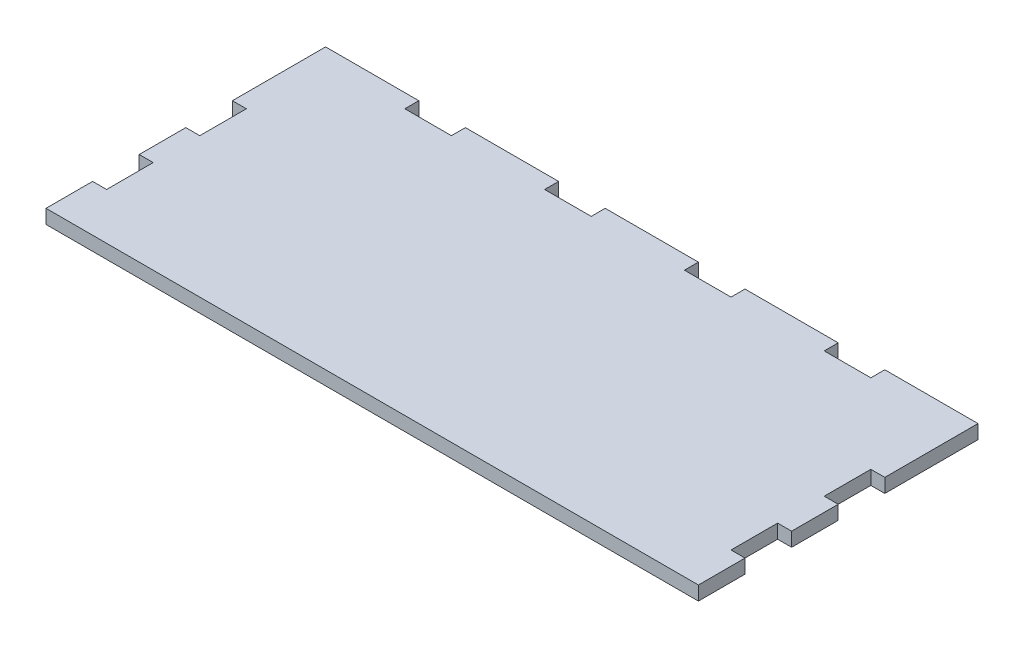
ISO-10303-21;
HEADER;
FILE_DESCRIPTION(('STEP AP214'),'2;1');
FILE_NAME('part.step','',(''),(''),'','','');
FILE_SCHEMA(('AUTOMOTIVE_DESIGN { 1 0 10303 214 1 1 1 1 }'));
ENDSEC;
DATA;
#1=APPLICATION_CONTEXT('core data for automotive mechanical design processes');
#2=APPLICATION_PROTOCOL_DEFINITION('international standard','automotive_design',2000,#1);
#3=PRODUCT_CONTEXT('',#1,'mechanical');
#4=PRODUCT('Part','Part','',(#3));
#5=PRODUCT_RELATED_PRODUCT_CATEGORY('part','',(#4));
#6=PRODUCT_DEFINITION_FORMATION('','',#4);
#7=PRODUCT_DEFINITION_CONTEXT('part definition',#1,'design');
#8=PRODUCT_DEFINITION('design','',#6,#7);
#9=PRODUCT_DEFINITION_SHAPE('','',#8);
#10=(LENGTH_UNIT() NAMED_UNIT(*) SI_UNIT(.MILLI.,.METRE.));
#11=(NAMED_UNIT(*) PLANE_ANGLE_UNIT() SI_UNIT($,.RADIAN.));
#12=(NAMED_UNIT(*) SI_UNIT($,.STERADIAN.) SOLID_ANGLE_UNIT());
#13=UNCERTAINTY_MEASURE_WITH_UNIT(LENGTH_MEASURE(1.E-05),#10,'distance_accuracy_value','');
#14=(GEOMETRIC_REPRESENTATION_CONTEXT(3) GLOBAL_UNCERTAINTY_ASSIGNED_CONTEXT((#13)) GLOBAL_UNIT_ASSIGNED_CONTEXT((#10,
#11,#12)) REPRESENTATION_CONTEXT('',''));
#15=CARTESIAN_POINT('',(0.,0.,0.));
#16=DIRECTION('',(0.,0.,1.));
#17=DIRECTION('',(1.,0.,0.));
#18=AXIS2_PLACEMENT_3D('',#15,#16,#17);
#19=CARTESIAN_POINT('',(70.,3.,-30.));
#20=DIRECTION('',(0.,0.,1.));
#21=DIRECTION('',(1.,0.,0.));
#22=AXIS2_PLACEMENT_3D('',#19,#20,#21);
#23=PLANE('',#22);
#24=DIRECTION('',(-1.,0.,0.));
#25=VECTOR('',#24,1.);
#26=CARTESIAN_POINT('',(70.,3.,-30.));
#27=LINE('',#26,#25);
#28=CARTESIAN_POINT('',(-50.,3.,-30.));
#29=VERTEX_POINT('',#28);
#30=CARTESIAN_POINT('',(-70.,3.,-30.));
#31=VERTEX_POINT('',#30);
#32=EDGE_CURVE('E425',#29,#31,#27,.T.);
#33=ORIENTED_EDGE('',*,*,#32,.F.);
#34=DIRECTION('',(0.,1.,0.));
#35=VECTOR('',#34,1.);
#36=CARTESIAN_POINT('',(-50.,-10.,-30.));
#37=LINE('',#36,#35);
#38=CARTESIAN_POINT('',(-50.,0.,-30.));
#39=VERTEX_POINT('',#38);
#40=EDGE_CURVE('E282',#39,#29,#37,.T.);
#41=ORIENTED_EDGE('',*,*,#40,.F.);
#42=DIRECTION('',(-1.,0.,0.));
#43=VECTOR('',#42,1.);
#44=CARTESIAN_POINT('',(70.,0.,-30.));
#45=LINE('',#44,#43);
#46=CARTESIAN_POINT('',(-70.,0.,-30.));
#47=VERTEX_POINT('',#46);
#48=EDGE_CURVE('E442',#39,#47,#45,.T.);
#49=ORIENTED_EDGE('',*,*,#48,.T.);
#50=DIRECTION('',(0.,-1.,0.));
#51=VECTOR('',#50,1.);
#52=CARTESIAN_POINT('',(-70.,3.,-30.));
#53=LINE('',#52,#51);
#54=EDGE_CURVE('E430',#31,#47,#53,.T.);
#55=ORIENTED_EDGE('',*,*,#54,.F.);
#56=EDGE_LOOP('',(#33,#41,#49,#55));
#57=FACE_BOUND('',#56,.T.);
#58=ADVANCED_FACE('F36',(#57),#23,.F.);
#59=CARTESIAN_POINT('',(9.99999999999999,0.,-30.));
#60=VERTEX_POINT('',#59);
#61=CARTESIAN_POINT('',(-10.,0.,-30.));
#62=VERTEX_POINT('',#61);
#63=EDGE_CURVE('E553',#60,#62,#45,.T.);
#64=ORIENTED_EDGE('',*,*,#63,.T.);
#65=DIRECTION('',(0.,1.,0.));
#66=VECTOR('',#65,1.);
#67=CARTESIAN_POINT('',(-10.,-10.,-30.));
#68=LINE('',#67,#66);
#69=CARTESIAN_POINT('',(-10.,3.,-30.));
#70=VERTEX_POINT('',#69);
#71=EDGE_CURVE('E285',#62,#70,#68,.T.);
#72=ORIENTED_EDGE('',*,*,#71,.T.);
#73=CARTESIAN_POINT('',(9.99999999999999,3.,-30.));
#74=VERTEX_POINT('',#73);
#75=EDGE_CURVE('E520',#74,#70,#27,.T.);
#76=ORIENTED_EDGE('',*,*,#75,.F.);
#77=DIRECTION('',(0.,1.,0.));
#78=VECTOR('',#77,1.);
#79=CARTESIAN_POINT('',(9.99999999999999,-10.,-30.));
#80=LINE('',#79,#78);
#81=EDGE_CURVE('E322',#60,#74,#80,.T.);
#82=ORIENTED_EDGE('',*,*,#81,.F.);
#83=EDGE_LOOP('',(#64,#72,#76,#82));
#84=FACE_BOUND('',#83,.T.);
#85=ADVANCED_FACE('F552',(#84),#23,.F.);
#86=CARTESIAN_POINT('',(40.,0.,-30.));
#87=VERTEX_POINT('',#86);
#88=CARTESIAN_POINT('',(20.,0.,-30.));
#89=VERTEX_POINT('',#88);
#90=EDGE_CURVE('E447',#87,#89,#45,.T.);
#91=ORIENTED_EDGE('',*,*,#90,.T.);
#92=DIRECTION('',(0.,1.,0.));
#93=VECTOR('',#92,1.);
#94=CARTESIAN_POINT('',(20.,-10.,-30.));
#95=LINE('',#94,#93);
#96=CARTESIAN_POINT('',(20.,3.,-30.));
#97=VERTEX_POINT('',#96);
#98=EDGE_CURVE('E301',#89,#97,#95,.T.);
#99=ORIENTED_EDGE('',*,*,#98,.T.);
#100=CARTESIAN_POINT('',(40.,3.,-30.));
#101=VERTEX_POINT('',#100);
#102=EDGE_CURVE('E431',#101,#97,#27,.T.);
#103=ORIENTED_EDGE('',*,*,#102,.F.);
#104=DIRECTION('',(0.,1.,0.));
#105=VECTOR('',#104,1.);
#106=CARTESIAN_POINT('',(40.,-10.,-30.));
#107=LINE('',#106,#105);
#108=EDGE_CURVE('E338',#87,#101,#107,.T.);
#109=ORIENTED_EDGE('',*,*,#108,.F.);
#110=EDGE_LOOP('',(#91,#99,#103,#109));
#111=FACE_BOUND('',#110,.T.);
#112=ADVANCED_FACE('F536',(#111),#23,.F.);
#113=CARTESIAN_POINT('',(70.,0.,-30.));
#114=VERTEX_POINT('',#113);
#115=CARTESIAN_POINT('',(50.,0.,-30.));
#116=VERTEX_POINT('',#115);
#117=EDGE_CURVE('E444',#114,#116,#45,.T.);
#118=ORIENTED_EDGE('',*,*,#117,.T.);
#119=DIRECTION('',(0.,1.,0.));
#120=VECTOR('',#119,1.);
#121=CARTESIAN_POINT('',(50.,-10.,-30.));
#122=LINE('',#121,#120);
#123=CARTESIAN_POINT('',(50.,3.,-30.));
#124=VERTEX_POINT('',#123);
#125=EDGE_CURVE('E317',#116,#124,#122,.T.);
#126=ORIENTED_EDGE('',*,*,#125,.T.);
#127=CARTESIAN_POINT('',(70.,3.,-30.));
#128=VERTEX_POINT('',#127);
#129=EDGE_CURVE('E427',#128,#124,#27,.T.);
#130=ORIENTED_EDGE('',*,*,#129,.F.);
#131=DIRECTION('',(0.,-1.,0.));
#132=VECTOR('',#131,1.);
#133=CARTESIAN_POINT('',(70.,3.,-30.));
#134=LINE('',#133,#132);
#135=EDGE_CURVE('E450',#128,#114,#134,.T.);
#136=ORIENTED_EDGE('',*,*,#135,.T.);
#137=EDGE_LOOP('',(#118,#126,#130,#136));
#138=FACE_BOUND('',#137,.T.);
#139=ADVANCED_FACE('F586',(#138),#23,.F.);
#140=CARTESIAN_POINT('',(-70.,3.,-30.));
#141=DIRECTION('',(1.,0.,0.));
#142=DIRECTION('',(0.,0.,-1.));
#143=AXIS2_PLACEMENT_3D('',#140,#141,#142);
#144=PLANE('',#143);
#145=DIRECTION('',(0.,0.,1.));
#146=VECTOR('',#145,1.);
#147=CARTESIAN_POINT('',(-70.,0.,-30.));
#148=LINE('',#147,#146);
#149=CARTESIAN_POINT('',(-70.,0.,0.));
#150=VERTEX_POINT('',#149);
#151=CARTESIAN_POINT('',(-70.,0.,10.));
#152=VERTEX_POINT('',#151);
#153=EDGE_CURVE('E436',#150,#152,#148,.T.);
#154=ORIENTED_EDGE('',*,*,#153,.T.);
#155=DIRECTION('',(0.,1.,0.));
#156=VECTOR('',#155,1.);
#157=CARTESIAN_POINT('',(-70.,-7.,10.));
#158=LINE('',#157,#156);
#159=CARTESIAN_POINT('',(-70.,3.,10.));
#160=VERTEX_POINT('',#159);
#161=EDGE_CURVE('E366',#152,#160,#158,.T.);
#162=ORIENTED_EDGE('',*,*,#161,.T.);
#163=DIRECTION('',(0.,0.,1.));
#164=VECTOR('',#163,1.);
#165=CARTESIAN_POINT('',(-70.,3.,-30.));
#166=LINE('',#165,#164);
#167=CARTESIAN_POINT('',(-70.,3.,0.));
#168=VERTEX_POINT('',#167);
#169=EDGE_CURVE('E418',#168,#160,#166,.T.);
#170=ORIENTED_EDGE('',*,*,#169,.F.);
#171=DIRECTION('',(0.,1.,0.));
#172=VECTOR('',#171,1.);
#173=CARTESIAN_POINT('',(-70.,-7.,0.));
#174=LINE('',#173,#172);
#175=EDGE_CURVE('E353',#150,#168,#174,.T.);
#176=ORIENTED_EDGE('',*,*,#175,.F.);
#177=EDGE_LOOP('',(#154,#162,#170,#176));
#178=FACE_BOUND('',#177,.T.);
#179=ADVANCED_FACE('F597',(#178),#144,.F.);
#180=CARTESIAN_POINT('',(-70.,0.,-9.99999999999999));
#181=VERTEX_POINT('',#180);
#182=EDGE_CURVE('E432',#47,#181,#148,.T.);
#183=ORIENTED_EDGE('',*,*,#182,.T.);
#184=DIRECTION('',(0.,1.,0.));
#185=VECTOR('',#184,1.);
#186=CARTESIAN_POINT('',(-70.,-7.,-9.99999999999999));
#187=LINE('',#186,#185);
#188=CARTESIAN_POINT('',(-70.,3.,-9.99999999999999));
#189=VERTEX_POINT('',#188);
#190=EDGE_CURVE('E354',#181,#189,#187,.T.);
#191=ORIENTED_EDGE('',*,*,#190,.T.);
#192=EDGE_CURVE('E414',#31,#189,#166,.T.);
#193=ORIENTED_EDGE('',*,*,#192,.F.);
#194=ORIENTED_EDGE('',*,*,#54,.T.);
#195=EDGE_LOOP('',(#183,#191,#193,#194));
#196=FACE_BOUND('',#195,.T.);
#197=ADVANCED_FACE('F603',(#196),#144,.F.);
#198=CARTESIAN_POINT('',(70.,3.,-30.));
#199=DIRECTION('',(-1.,0.,0.));
#200=DIRECTION('',(0.,0.,1.));
#201=AXIS2_PLACEMENT_3D('',#198,#199,#200);
#202=PLANE('',#201);
#203=DIRECTION('',(0.,0.,-1.));
#204=VECTOR('',#203,1.);
#205=CARTESIAN_POINT('',(70.,0.,-30.));
#206=LINE('',#205,#204);
#207=CARTESIAN_POINT('',(70.,0.,10.));
#208=VERTEX_POINT('',#207);
#209=CARTESIAN_POINT('',(70.,0.,0.));
#210=VERTEX_POINT('',#209);
#211=EDGE_CURVE('E443',#208,#210,#206,.T.);
#212=ORIENTED_EDGE('',*,*,#211,.T.);
#213=DIRECTION('',(0.,1.,0.));
#214=VECTOR('',#213,1.);
#215=CARTESIAN_POINT('',(70.,-7.,0.));
#216=LINE('',#215,#214);
#217=CARTESIAN_POINT('',(70.,3.,0.));
#218=VERTEX_POINT('',#217);
#219=EDGE_CURVE('E372',#210,#218,#216,.T.);
#220=ORIENTED_EDGE('',*,*,#219,.T.);
#221=DIRECTION('',(0.,0.,-1.));
#222=VECTOR('',#221,1.);
#223=CARTESIAN_POINT('',(70.,3.,-30.));
#224=LINE('',#223,#222);
#225=CARTESIAN_POINT('',(70.,3.,10.));
#226=VERTEX_POINT('',#225);
#227=EDGE_CURVE('E426',#226,#218,#224,.T.);
#228=ORIENTED_EDGE('',*,*,#227,.F.);
#229=DIRECTION('',(0.,1.,0.));
#230=VECTOR('',#229,1.);
#231=CARTESIAN_POINT('',(70.,-7.,10.));
#232=LINE('',#231,#230);
#233=EDGE_CURVE('E404',#208,#226,#232,.T.);
#234=ORIENTED_EDGE('',*,*,#233,.F.);
#235=EDGE_LOOP('',(#212,#220,#228,#234));
#236=FACE_BOUND('',#235,.T.);
#237=ADVANCED_FACE('F594',(#236),#202,.F.);
#238=CARTESIAN_POINT('',(70.,0.,30.));
#239=VERTEX_POINT('',#238);
#240=CARTESIAN_POINT('',(70.,0.,20.));
#241=VERTEX_POINT('',#240);
#242=EDGE_CURVE('E439',#239,#241,#206,.T.);
#243=ORIENTED_EDGE('',*,*,#242,.T.);
#244=DIRECTION('',(0.,1.,0.));
#245=VECTOR('',#244,1.);
#246=CARTESIAN_POINT('',(70.,-7.,20.));
#247=LINE('',#246,#245);
#248=CARTESIAN_POINT('',(70.,3.,20.));
#249=VERTEX_POINT('',#248);
#250=EDGE_CURVE('E405',#241,#249,#247,.T.);
#251=ORIENTED_EDGE('',*,*,#250,.T.);
#252=CARTESIAN_POINT('',(70.,3.,30.));
#253=VERTEX_POINT('',#252);
#254=EDGE_CURVE('E422',#253,#249,#224,.T.);
#255=ORIENTED_EDGE('',*,*,#254,.F.);
#256=DIRECTION('',(0.,-1.,0.));
#257=VECTOR('',#256,1.);
#258=CARTESIAN_POINT('',(70.,3.,30.));
#259=LINE('',#258,#257);
#260=EDGE_CURVE('E453',#253,#239,#259,.T.);
#261=ORIENTED_EDGE('',*,*,#260,.T.);
#262=EDGE_LOOP('',(#243,#251,#255,#261));
#263=FACE_BOUND('',#262,.T.);
#264=ADVANCED_FACE('F595',(#263),#202,.F.);
#265=CARTESIAN_POINT('',(-70.,3.,20.));
#266=VERTEX_POINT('',#265);
#267=CARTESIAN_POINT('',(-70.,3.,30.));
#268=VERTEX_POINT('',#267);
#269=EDGE_CURVE('E419',#266,#268,#166,.T.);
#270=ORIENTED_EDGE('',*,*,#269,.F.);
#271=DIRECTION('',(0.,1.,0.));
#272=VECTOR('',#271,1.);
#273=CARTESIAN_POINT('',(-70.,-7.,20.));
#274=LINE('',#273,#272);
#275=CARTESIAN_POINT('',(-70.,0.,20.));
#276=VERTEX_POINT('',#275);
#277=EDGE_CURVE('E389',#276,#266,#274,.T.);
#278=ORIENTED_EDGE('',*,*,#277,.F.);
#279=CARTESIAN_POINT('',(-70.,0.,30.));
#280=VERTEX_POINT('',#279);
#281=EDGE_CURVE('E408',#276,#280,#148,.T.);
#282=ORIENTED_EDGE('',*,*,#281,.T.);
#283=DIRECTION('',(0.,-1.,0.));
#284=VECTOR('',#283,1.);
#285=CARTESIAN_POINT('',(-70.,3.,30.));
#286=LINE('',#285,#284);
#287=EDGE_CURVE('E456',#268,#280,#286,.T.);
#288=ORIENTED_EDGE('',*,*,#287,.F.);
#289=EDGE_LOOP('',(#270,#278,#282,#288));
#290=FACE_BOUND('',#289,.T.);
#291=ADVANCED_FACE('F38',(#290),#144,.F.);
#292=CARTESIAN_POINT('',(70.,3.,30.));
#293=DIRECTION('',(0.,0.,-1.));
#294=DIRECTION('',(-1.,0.,0.));
#295=AXIS2_PLACEMENT_3D('',#292,#293,#294);
#296=PLANE('',#295);
#297=DIRECTION('',(1.,0.,0.));
#298=VECTOR('',#297,1.);
#299=CARTESIAN_POINT('',(70.,0.,30.));
#300=LINE('',#299,#298);
#301=EDGE_CURVE('E435',#280,#239,#300,.T.);
#302=ORIENTED_EDGE('',*,*,#301,.T.);
#303=ORIENTED_EDGE('',*,*,#260,.F.);
#304=DIRECTION('',(1.,0.,0.));
#305=VECTOR('',#304,1.);
#306=CARTESIAN_POINT('',(70.,3.,30.));
#307=LINE('',#306,#305);
#308=EDGE_CURVE('E417',#268,#253,#307,.T.);
#309=ORIENTED_EDGE('',*,*,#308,.F.);
#310=ORIENTED_EDGE('',*,*,#287,.T.);
#311=EDGE_LOOP('',(#302,#303,#309,#310));
#312=FACE_BOUND('',#311,.T.);
#313=ADVANCED_FACE('F592',(#312),#296,.F.);
#314=CARTESIAN_POINT('',(70.,3.,-9.99999999999999));
#315=VERTEX_POINT('',#314);
#316=EDGE_CURVE('E421',#315,#128,#224,.T.);
#317=ORIENTED_EDGE('',*,*,#316,.F.);
#318=DIRECTION('',(0.,1.,0.));
#319=VECTOR('',#318,1.);
#320=CARTESIAN_POINT('',(70.,-7.,-9.99999999999999));
#321=LINE('',#320,#319);
#322=CARTESIAN_POINT('',(70.,0.,-9.99999999999999));
#323=VERTEX_POINT('',#322);
#324=EDGE_CURVE('E378',#323,#315,#321,.T.);
#325=ORIENTED_EDGE('',*,*,#324,.F.);
#326=EDGE_CURVE('E438',#323,#114,#206,.T.);
#327=ORIENTED_EDGE('',*,*,#326,.T.);
#328=ORIENTED_EDGE('',*,*,#135,.F.);
#329=EDGE_LOOP('',(#317,#325,#327,#328));
#330=FACE_BOUND('',#329,.T.);
#331=ADVANCED_FACE('F585',(#330),#202,.F.);
#332=CARTESIAN_POINT('',(-20.,0.,-30.));
#333=VERTEX_POINT('',#332);
#334=CARTESIAN_POINT('',(-40.,0.,-30.));
#335=VERTEX_POINT('',#334);
#336=EDGE_CURVE('E566',#333,#335,#45,.T.);
#337=ORIENTED_EDGE('',*,*,#336,.T.);
#338=DIRECTION('',(0.,1.,0.));
#339=VECTOR('',#338,1.);
#340=CARTESIAN_POINT('',(-40.,-10.,-30.));
#341=LINE('',#340,#339);
#342=CARTESIAN_POINT('',(-40.,3.,-30.));
#343=VERTEX_POINT('',#342);
#344=EDGE_CURVE('E294',#335,#343,#341,.T.);
#345=ORIENTED_EDGE('',*,*,#344,.T.);
#346=CARTESIAN_POINT('',(-20.,3.,-30.));
#347=VERTEX_POINT('',#346);
#348=EDGE_CURVE('E519',#347,#343,#27,.T.);
#349=ORIENTED_EDGE('',*,*,#348,.F.);
#350=DIRECTION('',(0.,1.,0.));
#351=VECTOR('',#350,1.);
#352=CARTESIAN_POINT('',(-20.,-10.,-30.));
#353=LINE('',#352,#351);
#354=EDGE_CURVE('E306',#333,#347,#353,.T.);
#355=ORIENTED_EDGE('',*,*,#354,.F.);
#356=EDGE_LOOP('',(#337,#345,#349,#355));
#357=FACE_BOUND('',#356,.T.);
#358=ADVANCED_FACE('F565',(#357),#23,.F.);
#359=CARTESIAN_POINT('',(0.,3.,0.));
#360=DIRECTION('',(0.,-1.,0.));
#361=DIRECTION('',(0.,0.,-1.));
#362=AXIS2_PLACEMENT_3D('',#359,#360,#361);
#363=PLANE('',#362);
#364=DIRECTION('',(1.,0.,0.));
#365=VECTOR('',#364,1.);
#366=CARTESIAN_POINT('',(-50.,3.,-27.));
#367=LINE('',#366,#365);
#368=CARTESIAN_POINT('',(-50.,3.,-27.));
#369=VERTEX_POINT('',#368);
#370=CARTESIAN_POINT('',(-40.,3.,-27.));
#371=VERTEX_POINT('',#370);
#372=EDGE_CURVE('E270',#369,#371,#367,.T.);
#373=ORIENTED_EDGE('',*,*,#372,.F.);
#374=DIRECTION('',(0.,0.,1.));
#375=VECTOR('',#374,1.);
#376=CARTESIAN_POINT('',(-50.,3.,-30.));
#377=LINE('',#376,#375);
#378=EDGE_CURVE('E279',#29,#369,#377,.T.);
#379=ORIENTED_EDGE('',*,*,#378,.F.);
#380=ORIENTED_EDGE('',*,*,#32,.T.);
#381=ORIENTED_EDGE('',*,*,#192,.T.);
#382=DIRECTION('',(-1.,0.,0.));
#383=VECTOR('',#382,1.);
#384=CARTESIAN_POINT('',(-70.,3.,-9.99999999999999));
#385=LINE('',#384,#383);
#386=CARTESIAN_POINT('',(-66.9999999999999,3.,-9.99999999999999));
#387=VERTEX_POINT('',#386);
#388=EDGE_CURVE('E351',#387,#189,#385,.T.);
#389=ORIENTED_EDGE('',*,*,#388,.F.);
#390=DIRECTION('',(0.,0.,-1.));
#391=VECTOR('',#390,1.);
#392=CARTESIAN_POINT('',(-66.9999999999999,3.,0.));
#393=LINE('',#392,#391);
#394=CARTESIAN_POINT('',(-66.9999999999999,3.,0.));
#395=VERTEX_POINT('',#394);
#396=EDGE_CURVE('E348',#395,#387,#393,.T.);
#397=ORIENTED_EDGE('',*,*,#396,.F.);
#398=DIRECTION('',(1.,0.,0.));
#399=VECTOR('',#398,1.);
#400=CARTESIAN_POINT('',(-70.,3.,0.));
#401=LINE('',#400,#399);
#402=EDGE_CURVE('E293',#168,#395,#401,.T.);
#403=ORIENTED_EDGE('',*,*,#402,.F.);
#404=ORIENTED_EDGE('',*,*,#169,.T.);
#405=DIRECTION('',(-1.,0.,0.));
#406=VECTOR('',#405,1.);
#407=CARTESIAN_POINT('',(-70.,3.,10.));
#408=LINE('',#407,#406);
#409=CARTESIAN_POINT('',(-67.,3.,10.));
#410=VERTEX_POINT('',#409);
#411=EDGE_CURVE('E387',#410,#160,#408,.T.);
#412=ORIENTED_EDGE('',*,*,#411,.F.);
#413=DIRECTION('',(0.,0.,-1.));
#414=VECTOR('',#413,1.);
#415=CARTESIAN_POINT('',(-67.,3.,20.));
#416=LINE('',#415,#414);
#417=CARTESIAN_POINT('',(-67.,3.,20.));
#418=VERTEX_POINT('',#417);
#419=EDGE_CURVE('E384',#418,#410,#416,.T.);
#420=ORIENTED_EDGE('',*,*,#419,.F.);
#421=DIRECTION('',(1.,0.,0.));
#422=VECTOR('',#421,1.);
#423=CARTESIAN_POINT('',(-70.,3.,20.));
#424=LINE('',#423,#422);
#425=EDGE_CURVE('E357',#266,#418,#424,.T.);
#426=ORIENTED_EDGE('',*,*,#425,.F.);
#427=ORIENTED_EDGE('',*,*,#269,.T.);
#428=ORIENTED_EDGE('',*,*,#308,.T.);
#429=ORIENTED_EDGE('',*,*,#254,.T.);
#430=DIRECTION('',(1.,0.,0.));
#431=VECTOR('',#430,1.);
#432=CARTESIAN_POINT('',(70.,3.,20.));
#433=LINE('',#432,#431);
#434=CARTESIAN_POINT('',(67.,3.,20.));
#435=VERTEX_POINT('',#434);
#436=EDGE_CURVE('E402',#435,#249,#433,.T.);
#437=ORIENTED_EDGE('',*,*,#436,.F.);
#438=DIRECTION('',(0.,0.,1.));
#439=VECTOR('',#438,1.);
#440=CARTESIAN_POINT('',(67.,3.,20.));
#441=LINE('',#440,#439);
#442=CARTESIAN_POINT('',(67.,3.,10.));
#443=VERTEX_POINT('',#442);
#444=EDGE_CURVE('E399',#443,#435,#441,.T.);
#445=ORIENTED_EDGE('',*,*,#444,.F.);
#446=DIRECTION('',(-1.,0.,0.));
#447=VECTOR('',#446,1.);
#448=CARTESIAN_POINT('',(70.,3.,10.));
#449=LINE('',#448,#447);
#450=EDGE_CURVE('E375',#226,#443,#449,.T.);
#451=ORIENTED_EDGE('',*,*,#450,.F.);
#452=ORIENTED_EDGE('',*,*,#227,.T.);
#453=DIRECTION('',(1.,0.,0.));
#454=VECTOR('',#453,1.);
#455=CARTESIAN_POINT('',(70.,3.,0.));
#456=LINE('',#455,#454);
#457=CARTESIAN_POINT('',(66.9999999999999,3.,0.));
#458=VERTEX_POINT('',#457);
#459=EDGE_CURVE('E363',#458,#218,#456,.T.);
#460=ORIENTED_EDGE('',*,*,#459,.F.);
#461=DIRECTION('',(0.,0.,1.));
#462=VECTOR('',#461,1.);
#463=CARTESIAN_POINT('',(66.9999999999999,3.,0.));
#464=LINE('',#463,#462);
#465=CARTESIAN_POINT('',(66.9999999999999,3.,-9.99999999999999));
#466=VERTEX_POINT('',#465);
#467=EDGE_CURVE('E369',#466,#458,#464,.T.);
#468=ORIENTED_EDGE('',*,*,#467,.F.);
#469=DIRECTION('',(-1.,0.,0.));
#470=VECTOR('',#469,1.);
#471=CARTESIAN_POINT('',(70.,3.,-9.99999999999999));
#472=LINE('',#471,#470);
#473=EDGE_CURVE('E365',#315,#466,#472,.T.);
#474=ORIENTED_EDGE('',*,*,#473,.F.);
#475=ORIENTED_EDGE('',*,*,#316,.T.);
#476=ORIENTED_EDGE('',*,*,#129,.T.);
#477=DIRECTION('',(0.,0.,-1.));
#478=VECTOR('',#477,1.);
#479=CARTESIAN_POINT('',(50.,3.,-30.));
#480=LINE('',#479,#478);
#481=CARTESIAN_POINT('',(50.,3.,-27.));
#482=VERTEX_POINT('',#481);
#483=EDGE_CURVE('E336',#482,#124,#480,.T.);
#484=ORIENTED_EDGE('',*,*,#483,.F.);
#485=DIRECTION('',(1.,0.,0.));
#486=VECTOR('',#485,1.);
#487=CARTESIAN_POINT('',(40.,3.,-27.));
#488=LINE('',#487,#486);
#489=CARTESIAN_POINT('',(40.,3.,-27.));
#490=VERTEX_POINT('',#489);
#491=EDGE_CURVE('E333',#490,#482,#488,.T.);
#492=ORIENTED_EDGE('',*,*,#491,.F.);
#493=DIRECTION('',(0.,0.,1.));
#494=VECTOR('',#493,1.);
#495=CARTESIAN_POINT('',(40.,3.,-30.));
#496=LINE('',#495,#494);
#497=EDGE_CURVE('E330',#101,#490,#496,.T.);
#498=ORIENTED_EDGE('',*,*,#497,.F.);
#499=ORIENTED_EDGE('',*,*,#102,.T.);
#500=DIRECTION('',(0.,0.,-1.));
#501=VECTOR('',#500,1.);
#502=CARTESIAN_POINT('',(20.,3.,-30.));
#503=LINE('',#502,#501);
#504=CARTESIAN_POINT('',(20.,3.,-27.));
#505=VERTEX_POINT('',#504);
#506=EDGE_CURVE('E320',#505,#97,#503,.T.);
#507=ORIENTED_EDGE('',*,*,#506,.F.);
#508=DIRECTION('',(1.,0.,0.));
#509=VECTOR('',#508,1.);
#510=CARTESIAN_POINT('',(9.99999999999999,3.,-27.));
#511=LINE('',#510,#509);
#512=CARTESIAN_POINT('',(9.99999999999999,3.,-27.));
#513=VERTEX_POINT('',#512);
#514=EDGE_CURVE('E316',#513,#505,#511,.T.);
#515=ORIENTED_EDGE('',*,*,#514,.F.);
#516=DIRECTION('',(0.,0.,1.));
#517=VECTOR('',#516,1.);
#518=CARTESIAN_POINT('',(9.99999999999999,3.,-30.));
#519=LINE('',#518,#517);
#520=EDGE_CURVE('E313',#74,#513,#519,.T.);
#521=ORIENTED_EDGE('',*,*,#520,.F.);
#522=ORIENTED_EDGE('',*,*,#75,.T.);
#523=DIRECTION('',(0.,0.,-1.));
#524=VECTOR('',#523,1.);
#525=CARTESIAN_POINT('',(-10.,3.,-30.));
#526=LINE('',#525,#524);
#527=CARTESIAN_POINT('',(-10.,3.,-27.));
#528=VERTEX_POINT('',#527);
#529=EDGE_CURVE('E304',#528,#70,#526,.T.);
#530=ORIENTED_EDGE('',*,*,#529,.F.);
#531=DIRECTION('',(1.,0.,0.));
#532=VECTOR('',#531,1.);
#533=CARTESIAN_POINT('',(-20.,3.,-27.));
#534=LINE('',#533,#532);
#535=CARTESIAN_POINT('',(-20.,3.,-27.));
#536=VERTEX_POINT('',#535);
#537=EDGE_CURVE('E300',#536,#528,#534,.T.);
#538=ORIENTED_EDGE('',*,*,#537,.F.);
#539=DIRECTION('',(0.,0.,1.));
#540=VECTOR('',#539,1.);
#541=CARTESIAN_POINT('',(-20.,3.,-30.));
#542=LINE('',#541,#540);
#543=EDGE_CURVE('E298',#347,#536,#542,.T.);
#544=ORIENTED_EDGE('',*,*,#543,.F.);
#545=ORIENTED_EDGE('',*,*,#348,.T.);
#546=DIRECTION('',(0.,0.,-1.));
#547=VECTOR('',#546,1.);
#548=CARTESIAN_POINT('',(-40.,3.,-30.));
#549=LINE('',#548,#547);
#550=EDGE_CURVE('E276',#371,#343,#549,.T.);
#551=ORIENTED_EDGE('',*,*,#550,.F.);
#552=EDGE_LOOP('',(#373,#379,#380,#381,#389,#397,#403,#404,#412,#420,#426,#427,#428,#429,#437,
#445,#451,#452,#460,#468,#474,#475,#476,#484,#492,#498,#499,#507,#515,#521,#522,#530,#538,#544,
#545,#551));
#553=FACE_BOUND('',#552,.T.);
#554=ADVANCED_FACE('F287',(#553),#363,.F.);
#555=CARTESIAN_POINT('',(0.,0.,0.));
#556=DIRECTION('',(0.,-1.,0.));
#557=DIRECTION('',(0.,0.,-1.));
#558=AXIS2_PLACEMENT_3D('',#555,#556,#557);
#559=PLANE('',#558);
#560=DIRECTION('',(0.,0.,-1.));
#561=VECTOR('',#560,1.);
#562=CARTESIAN_POINT('',(-50.,0.,0.));
#563=LINE('',#562,#561);
#564=CARTESIAN_POINT('',(-50.,0.,-27.));
#565=VERTEX_POINT('',#564);
#566=EDGE_CURVE('E11',#565,#39,#563,.T.);
#567=ORIENTED_EDGE('',*,*,#566,.F.);
#568=DIRECTION('',(-1.,0.,0.));
#569=VECTOR('',#568,1.);
#570=CARTESIAN_POINT('',(0.,0.,-27.));
#571=LINE('',#570,#569);
#572=CARTESIAN_POINT('',(-40.,0.,-27.));
#573=VERTEX_POINT('',#572);
#574=EDGE_CURVE('E273',#573,#565,#571,.T.);
#575=ORIENTED_EDGE('',*,*,#574,.F.);
#576=DIRECTION('',(0.,0.,1.));
#577=VECTOR('',#576,1.);
#578=CARTESIAN_POINT('',(-40.,0.,0.));
#579=LINE('',#578,#577);
#580=EDGE_CURVE('E44',#335,#573,#579,.T.);
#581=ORIENTED_EDGE('',*,*,#580,.F.);
#582=ORIENTED_EDGE('',*,*,#336,.F.);
#583=DIRECTION('',(0.,0.,-1.));
#584=VECTOR('',#583,1.);
#585=CARTESIAN_POINT('',(-20.,0.,0.));
#586=LINE('',#585,#584);
#587=CARTESIAN_POINT('',(-20.,0.,-27.));
#588=VERTEX_POINT('',#587);
#589=EDGE_CURVE('E501',#588,#333,#586,.T.);
#590=ORIENTED_EDGE('',*,*,#589,.F.);
#591=DIRECTION('',(-1.,0.,0.));
#592=VECTOR('',#591,1.);
#593=CARTESIAN_POINT('',(0.,0.,-27.));
#594=LINE('',#593,#592);
#595=CARTESIAN_POINT('',(-10.,0.,-27.));
#596=VERTEX_POINT('',#595);
#597=EDGE_CURVE('E503',#596,#588,#594,.T.);
#598=ORIENTED_EDGE('',*,*,#597,.F.);
#599=DIRECTION('',(0.,0.,1.));
#600=VECTOR('',#599,1.);
#601=CARTESIAN_POINT('',(-10.,0.,0.));
#602=LINE('',#601,#600);
#603=EDGE_CURVE('E505',#62,#596,#602,.T.);
#604=ORIENTED_EDGE('',*,*,#603,.F.);
#605=ORIENTED_EDGE('',*,*,#63,.F.);
#606=DIRECTION('',(0.,0.,-1.));
#607=VECTOR('',#606,1.);
#608=CARTESIAN_POINT('',(9.99999999999999,0.,0.));
#609=LINE('',#608,#607);
#610=CARTESIAN_POINT('',(9.99999999999999,0.,-27.));
#611=VERTEX_POINT('',#610);
#612=EDGE_CURVE('E494',#611,#60,#609,.T.);
#613=ORIENTED_EDGE('',*,*,#612,.F.);
#614=DIRECTION('',(-1.,0.,0.));
#615=VECTOR('',#614,1.);
#616=CARTESIAN_POINT('',(0.,0.,-27.));
#617=LINE('',#616,#615);
#618=CARTESIAN_POINT('',(20.,0.,-27.));
#619=VERTEX_POINT('',#618);
#620=EDGE_CURVE('E496',#619,#611,#617,.T.);
#621=ORIENTED_EDGE('',*,*,#620,.F.);
#622=DIRECTION('',(0.,0.,1.));
#623=VECTOR('',#622,1.);
#624=CARTESIAN_POINT('',(20.,0.,0.));
#625=LINE('',#624,#623);
#626=EDGE_CURVE('E499',#89,#619,#625,.T.);
#627=ORIENTED_EDGE('',*,*,#626,.F.);
#628=ORIENTED_EDGE('',*,*,#90,.F.);
#629=DIRECTION('',(0.,0.,-1.));
#630=VECTOR('',#629,1.);
#631=CARTESIAN_POINT('',(40.,0.,0.));
#632=LINE('',#631,#630);
#633=CARTESIAN_POINT('',(40.,0.,-27.));
#634=VERTEX_POINT('',#633);
#635=EDGE_CURVE('E487',#634,#87,#632,.T.);
#636=ORIENTED_EDGE('',*,*,#635,.F.);
#637=DIRECTION('',(-1.,0.,0.));
#638=VECTOR('',#637,1.);
#639=CARTESIAN_POINT('',(0.,0.,-27.));
#640=LINE('',#639,#638);
#641=CARTESIAN_POINT('',(50.,0.,-27.));
#642=VERTEX_POINT('',#641);
#643=EDGE_CURVE('E489',#642,#634,#640,.T.);
#644=ORIENTED_EDGE('',*,*,#643,.F.);
#645=DIRECTION('',(0.,0.,1.));
#646=VECTOR('',#645,1.);
#647=CARTESIAN_POINT('',(50.,0.,0.));
#648=LINE('',#647,#646);
#649=EDGE_CURVE('E492',#116,#642,#648,.T.);
#650=ORIENTED_EDGE('',*,*,#649,.F.);
#651=ORIENTED_EDGE('',*,*,#117,.F.);
#652=ORIENTED_EDGE('',*,*,#326,.F.);
#653=DIRECTION('',(1.,0.,0.));
#654=VECTOR('',#653,1.);
#655=CARTESIAN_POINT('',(0.,0.,-9.99999999999999));
#656=LINE('',#655,#654);
#657=CARTESIAN_POINT('',(66.9999999999999,0.,-9.99999999999999));
#658=VERTEX_POINT('',#657);
#659=EDGE_CURVE('E480',#658,#323,#656,.T.);
#660=ORIENTED_EDGE('',*,*,#659,.F.);
#661=DIRECTION('',(0.,0.,-1.));
#662=VECTOR('',#661,1.);
#663=CARTESIAN_POINT('',(66.9999999999999,0.,0.));
#664=LINE('',#663,#662);
#665=CARTESIAN_POINT('',(66.9999999999999,0.,0.));
#666=VERTEX_POINT('',#665);
#667=EDGE_CURVE('E482',#666,#658,#664,.T.);
#668=ORIENTED_EDGE('',*,*,#667,.F.);
#669=DIRECTION('',(-1.,0.,0.));
#670=VECTOR('',#669,1.);
#671=CARTESIAN_POINT('',(0.,0.,0.));
#672=LINE('',#671,#670);
#673=EDGE_CURVE('E485',#210,#666,#672,.T.);
#674=ORIENTED_EDGE('',*,*,#673,.F.);
#675=ORIENTED_EDGE('',*,*,#211,.F.);
#676=DIRECTION('',(1.,0.,0.));
#677=VECTOR('',#676,1.);
#678=CARTESIAN_POINT('',(0.,0.,10.));
#679=LINE('',#678,#677);
#680=CARTESIAN_POINT('',(67.,0.,10.));
#681=VERTEX_POINT('',#680);
#682=EDGE_CURVE('E459',#681,#208,#679,.T.);
#683=ORIENTED_EDGE('',*,*,#682,.F.);
#684=DIRECTION('',(0.,0.,-1.));
#685=VECTOR('',#684,1.);
#686=CARTESIAN_POINT('',(67.,0.,0.));
#687=LINE('',#686,#685);
#688=CARTESIAN_POINT('',(67.,0.,20.));
#689=VERTEX_POINT('',#688);
#690=EDGE_CURVE('E461',#689,#681,#687,.T.);
#691=ORIENTED_EDGE('',*,*,#690,.F.);
#692=DIRECTION('',(-1.,0.,0.));
#693=VECTOR('',#692,1.);
#694=CARTESIAN_POINT('',(0.,0.,20.));
#695=LINE('',#694,#693);
#696=EDGE_CURVE('E464',#241,#689,#695,.T.);
#697=ORIENTED_EDGE('',*,*,#696,.F.);
#698=ORIENTED_EDGE('',*,*,#242,.F.);
#699=ORIENTED_EDGE('',*,*,#301,.F.);
#700=ORIENTED_EDGE('',*,*,#281,.F.);
#701=DIRECTION('',(-1.,0.,0.));
#702=VECTOR('',#701,1.);
#703=CARTESIAN_POINT('',(0.,0.,20.));
#704=LINE('',#703,#702);
#705=CARTESIAN_POINT('',(-67.,0.,20.));
#706=VERTEX_POINT('',#705);
#707=EDGE_CURVE('E473',#706,#276,#704,.T.);
#708=ORIENTED_EDGE('',*,*,#707,.F.);
#709=DIRECTION('',(0.,0.,1.));
#710=VECTOR('',#709,1.);
#711=CARTESIAN_POINT('',(-67.,0.,0.));
#712=LINE('',#711,#710);
#713=CARTESIAN_POINT('',(-67.,0.,10.));
#714=VERTEX_POINT('',#713);
#715=EDGE_CURVE('E475',#714,#706,#712,.T.);
#716=ORIENTED_EDGE('',*,*,#715,.F.);
#717=DIRECTION('',(1.,0.,0.));
#718=VECTOR('',#717,1.);
#719=CARTESIAN_POINT('',(0.,0.,10.));
#720=LINE('',#719,#718);
#721=EDGE_CURVE('E478',#152,#714,#720,.T.);
#722=ORIENTED_EDGE('',*,*,#721,.F.);
#723=ORIENTED_EDGE('',*,*,#153,.F.);
#724=DIRECTION('',(-1.,0.,0.));
#725=VECTOR('',#724,1.);
#726=CARTESIAN_POINT('',(0.,0.,0.));
#727=LINE('',#726,#725);
#728=CARTESIAN_POINT('',(-66.9999999999999,0.,0.));
#729=VERTEX_POINT('',#728);
#730=EDGE_CURVE('E466',#729,#150,#727,.T.);
#731=ORIENTED_EDGE('',*,*,#730,.F.);
#732=DIRECTION('',(0.,0.,1.));
#733=VECTOR('',#732,1.);
#734=CARTESIAN_POINT('',(-66.9999999999999,0.,0.));
#735=LINE('',#734,#733);
#736=CARTESIAN_POINT('',(-66.9999999999999,0.,-9.99999999999999));
#737=VERTEX_POINT('',#736);
#738=EDGE_CURVE('E468',#737,#729,#735,.T.);
#739=ORIENTED_EDGE('',*,*,#738,.F.);
#740=DIRECTION('',(1.,0.,0.));
#741=VECTOR('',#740,1.);
#742=CARTESIAN_POINT('',(0.,0.,-9.99999999999999));
#743=LINE('',#742,#741);
#744=EDGE_CURVE('E471',#181,#737,#743,.T.);
#745=ORIENTED_EDGE('',*,*,#744,.F.);
#746=ORIENTED_EDGE('',*,*,#182,.F.);
#747=ORIENTED_EDGE('',*,*,#48,.F.);
#748=EDGE_LOOP('',(#567,#575,#581,#582,#590,#598,#604,#605,#613,#621,#627,#628,#636,#644,#650,
#651,#652,#660,#668,#674,#675,#683,#691,#697,#698,#699,#700,#708,#716,#722,#723,#731,#739,#745,
#746,#747));
#749=FACE_BOUND('',#748,.T.);
#750=ADVANCED_FACE('F513',(#749),#559,.T.);
#751=CARTESIAN_POINT('',(70.,-7.,20.));
#752=DIRECTION('',(0.,0.,1.));
#753=DIRECTION('',(1.,0.,0.));
#754=AXIS2_PLACEMENT_3D('',#751,#752,#753);
#755=PLANE('',#754);
#756=ORIENTED_EDGE('',*,*,#696,.T.);
#757=DIRECTION('',(0.,1.,0.));
#758=VECTOR('',#757,1.);
#759=CARTESIAN_POINT('',(67.,-7.,20.));
#760=LINE('',#759,#758);
#761=EDGE_CURVE('E409',#689,#435,#760,.T.);
#762=ORIENTED_EDGE('',*,*,#761,.T.);
#763=ORIENTED_EDGE('',*,*,#436,.T.);
#764=ORIENTED_EDGE('',*,*,#250,.F.);
#765=EDGE_LOOP('',(#756,#762,#763,#764));
#766=FACE_BOUND('',#765,.T.);
#767=ADVANCED_FACE('F692',(#766),#755,.F.);
#768=CARTESIAN_POINT('',(67.,-7.,20.));
#769=DIRECTION('',(-1.,0.,0.));
#770=DIRECTION('',(0.,0.,1.));
#771=AXIS2_PLACEMENT_3D('',#768,#769,#770);
#772=PLANE('',#771);
#773=ORIENTED_EDGE('',*,*,#690,.T.);
#774=DIRECTION('',(0.,1.,0.));
#775=VECTOR('',#774,1.);
#776=CARTESIAN_POINT('',(67.,-7.,10.));
#777=LINE('',#776,#775);
#778=EDGE_CURVE('E411',#681,#443,#777,.T.);
#779=ORIENTED_EDGE('',*,*,#778,.T.);
#780=ORIENTED_EDGE('',*,*,#444,.T.);
#781=ORIENTED_EDGE('',*,*,#761,.F.);
#782=EDGE_LOOP('',(#773,#779,#780,#781));
#783=FACE_BOUND('',#782,.T.);
#784=ADVANCED_FACE('F645',(#783),#772,.F.);
#785=CARTESIAN_POINT('',(70.,-7.,10.));
#786=DIRECTION('',(0.,0.,-1.));
#787=DIRECTION('',(-1.,0.,0.));
#788=AXIS2_PLACEMENT_3D('',#785,#786,#787);
#789=PLANE('',#788);
#790=ORIENTED_EDGE('',*,*,#682,.T.);
#791=ORIENTED_EDGE('',*,*,#233,.T.);
#792=ORIENTED_EDGE('',*,*,#450,.T.);
#793=ORIENTED_EDGE('',*,*,#778,.F.);
#794=EDGE_LOOP('',(#790,#791,#792,#793));
#795=FACE_BOUND('',#794,.T.);
#796=ADVANCED_FACE('F642',(#795),#789,.F.);
#797=CARTESIAN_POINT('',(-70.,-7.,-9.99999999999999));
#798=DIRECTION('',(0.,0.,-1.));
#799=DIRECTION('',(-1.,0.,0.));
#800=AXIS2_PLACEMENT_3D('',#797,#798,#799);
#801=PLANE('',#800);
#802=ORIENTED_EDGE('',*,*,#744,.T.);
#803=DIRECTION('',(0.,1.,0.));
#804=VECTOR('',#803,1.);
#805=CARTESIAN_POINT('',(-66.9999999999999,-7.,-9.99999999999999));
#806=LINE('',#805,#804);
#807=EDGE_CURVE('E358',#737,#387,#806,.T.);
#808=ORIENTED_EDGE('',*,*,#807,.T.);
#809=ORIENTED_EDGE('',*,*,#388,.T.);
#810=ORIENTED_EDGE('',*,*,#190,.F.);
#811=EDGE_LOOP('',(#802,#808,#809,#810));
#812=FACE_BOUND('',#811,.T.);
#813=ADVANCED_FACE('F698',(#812),#801,.F.);
#814=CARTESIAN_POINT('',(-66.9999999999999,-7.,0.));
#815=DIRECTION('',(1.,0.,0.));
#816=DIRECTION('',(0.,0.,-1.));
#817=AXIS2_PLACEMENT_3D('',#814,#815,#816);
#818=PLANE('',#817);
#819=ORIENTED_EDGE('',*,*,#738,.T.);
#820=DIRECTION('',(0.,1.,0.));
#821=VECTOR('',#820,1.);
#822=CARTESIAN_POINT('',(-66.9999999999999,-7.,0.));
#823=LINE('',#822,#821);
#824=EDGE_CURVE('E360',#729,#395,#823,.T.);
#825=ORIENTED_EDGE('',*,*,#824,.T.);
#826=ORIENTED_EDGE('',*,*,#396,.T.);
#827=ORIENTED_EDGE('',*,*,#807,.F.);
#828=EDGE_LOOP('',(#819,#825,#826,#827));
#829=FACE_BOUND('',#828,.T.);
#830=ADVANCED_FACE('F724',(#829),#818,.F.);
#831=CARTESIAN_POINT('',(-70.,-7.,0.));
#832=DIRECTION('',(0.,0.,1.));
#833=DIRECTION('',(1.,0.,0.));
#834=AXIS2_PLACEMENT_3D('',#831,#832,#833);
#835=PLANE('',#834);
#836=ORIENTED_EDGE('',*,*,#730,.T.);
#837=ORIENTED_EDGE('',*,*,#175,.T.);
#838=ORIENTED_EDGE('',*,*,#402,.T.);
#839=ORIENTED_EDGE('',*,*,#824,.F.);
#840=EDGE_LOOP('',(#836,#837,#838,#839));
#841=FACE_BOUND('',#840,.T.);
#842=ADVANCED_FACE('F732',(#841),#835,.F.);
#843=CARTESIAN_POINT('',(-70.,-7.,10.));
#844=DIRECTION('',(0.,0.,-1.));
#845=DIRECTION('',(-1.,0.,0.));
#846=AXIS2_PLACEMENT_3D('',#843,#844,#845);
#847=PLANE('',#846);
#848=ORIENTED_EDGE('',*,*,#721,.T.);
#849=DIRECTION('',(0.,1.,0.));
#850=VECTOR('',#849,1.);
#851=CARTESIAN_POINT('',(-67.,-7.,10.));
#852=LINE('',#851,#850);
#853=EDGE_CURVE('E392',#714,#410,#852,.T.);
#854=ORIENTED_EDGE('',*,*,#853,.T.);
#855=ORIENTED_EDGE('',*,*,#411,.T.);
#856=ORIENTED_EDGE('',*,*,#161,.F.);
#857=EDGE_LOOP('',(#848,#854,#855,#856));
#858=FACE_BOUND('',#857,.T.);
#859=ADVANCED_FACE('F671',(#858),#847,.F.);
#860=CARTESIAN_POINT('',(-67.,-7.,20.));
#861=DIRECTION('',(1.,0.,0.));
#862=DIRECTION('',(0.,0.,-1.));
#863=AXIS2_PLACEMENT_3D('',#860,#861,#862);
#864=PLANE('',#863);
#865=ORIENTED_EDGE('',*,*,#715,.T.);
#866=DIRECTION('',(0.,1.,0.));
#867=VECTOR('',#866,1.);
#868=CARTESIAN_POINT('',(-67.,-7.,20.));
#869=LINE('',#868,#867);
#870=EDGE_CURVE('E394',#706,#418,#869,.T.);
#871=ORIENTED_EDGE('',*,*,#870,.T.);
#872=ORIENTED_EDGE('',*,*,#419,.T.);
#873=ORIENTED_EDGE('',*,*,#853,.F.);
#874=EDGE_LOOP('',(#865,#871,#872,#873));
#875=FACE_BOUND('',#874,.T.);
#876=ADVANCED_FACE('F673',(#875),#864,.F.);
#877=CARTESIAN_POINT('',(-70.,-7.,20.));
#878=DIRECTION('',(0.,0.,1.));
#879=DIRECTION('',(1.,0.,0.));
#880=AXIS2_PLACEMENT_3D('',#877,#878,#879);
#881=PLANE('',#880);
#882=ORIENTED_EDGE('',*,*,#707,.T.);
#883=ORIENTED_EDGE('',*,*,#277,.T.);
#884=ORIENTED_EDGE('',*,*,#425,.T.);
#885=ORIENTED_EDGE('',*,*,#870,.F.);
#886=EDGE_LOOP('',(#882,#883,#884,#885));
#887=FACE_BOUND('',#886,.T.);
#888=ADVANCED_FACE('F681',(#887),#881,.F.);
#889=CARTESIAN_POINT('',(70.,-7.,0.));
#890=DIRECTION('',(0.,0.,1.));
#891=DIRECTION('',(1.,0.,0.));
#892=AXIS2_PLACEMENT_3D('',#889,#890,#891);
#893=PLANE('',#892);
#894=ORIENTED_EDGE('',*,*,#673,.T.);
#895=DIRECTION('',(0.,1.,0.));
#896=VECTOR('',#895,1.);
#897=CARTESIAN_POINT('',(66.9999999999999,-7.,0.));
#898=LINE('',#897,#896);
#899=EDGE_CURVE('E373',#666,#458,#898,.T.);
#900=ORIENTED_EDGE('',*,*,#899,.T.);
#901=ORIENTED_EDGE('',*,*,#459,.T.);
#902=ORIENTED_EDGE('',*,*,#219,.F.);
#903=EDGE_LOOP('',(#894,#900,#901,#902));
#904=FACE_BOUND('',#903,.T.);
#905=ADVANCED_FACE('F634',(#904),#893,.F.);
#906=CARTESIAN_POINT('',(66.9999999999999,-7.,0.));
#907=DIRECTION('',(-1.,0.,0.));
#908=DIRECTION('',(0.,0.,1.));
#909=AXIS2_PLACEMENT_3D('',#906,#907,#908);
#910=PLANE('',#909);
#911=ORIENTED_EDGE('',*,*,#667,.T.);
#912=DIRECTION('',(0.,1.,0.));
#913=VECTOR('',#912,1.);
#914=CARTESIAN_POINT('',(66.9999999999999,-7.,-9.99999999999999));
#915=LINE('',#914,#913);
#916=EDGE_CURVE('E376',#658,#466,#915,.T.);
#917=ORIENTED_EDGE('',*,*,#916,.T.);
#918=ORIENTED_EDGE('',*,*,#467,.T.);
#919=ORIENTED_EDGE('',*,*,#899,.F.);
#920=EDGE_LOOP('',(#911,#917,#918,#919));
#921=FACE_BOUND('',#920,.T.);
#922=ADVANCED_FACE('F636',(#921),#910,.F.);
#923=CARTESIAN_POINT('',(70.,-7.,-9.99999999999999));
#924=DIRECTION('',(0.,0.,-1.));
#925=DIRECTION('',(-1.,0.,0.));
#926=AXIS2_PLACEMENT_3D('',#923,#924,#925);
#927=PLANE('',#926);
#928=ORIENTED_EDGE('',*,*,#659,.T.);
#929=ORIENTED_EDGE('',*,*,#324,.T.);
#930=ORIENTED_EDGE('',*,*,#473,.T.);
#931=ORIENTED_EDGE('',*,*,#916,.F.);
#932=EDGE_LOOP('',(#928,#929,#930,#931));
#933=FACE_BOUND('',#932,.T.);
#934=ADVANCED_FACE('F769',(#933),#927,.F.);
#935=CARTESIAN_POINT('',(50.,-10.,-30.));
#936=DIRECTION('',(1.,0.,0.));
#937=DIRECTION('',(0.,0.,-1.));
#938=AXIS2_PLACEMENT_3D('',#935,#936,#937);
#939=PLANE('',#938);
#940=ORIENTED_EDGE('',*,*,#649,.T.);
#941=DIRECTION('',(0.,1.,0.));
#942=VECTOR('',#941,1.);
#943=CARTESIAN_POINT('',(50.,-10.,-27.));
#944=LINE('',#943,#942);
#945=EDGE_CURVE('E341',#642,#482,#944,.T.);
#946=ORIENTED_EDGE('',*,*,#945,.T.);
#947=ORIENTED_EDGE('',*,*,#483,.T.);
#948=ORIENTED_EDGE('',*,*,#125,.F.);
#949=EDGE_LOOP('',(#940,#946,#947,#948));
#950=FACE_BOUND('',#949,.T.);
#951=ADVANCED_FACE('F614',(#950),#939,.F.);
#952=CARTESIAN_POINT('',(40.,-10.,-27.));
#953=DIRECTION('',(0.,0.,1.));
#954=DIRECTION('',(1.,0.,0.));
#955=AXIS2_PLACEMENT_3D('',#952,#953,#954);
#956=PLANE('',#955);
#957=ORIENTED_EDGE('',*,*,#643,.T.);
#958=DIRECTION('',(0.,1.,0.));
#959=VECTOR('',#958,1.);
#960=CARTESIAN_POINT('',(40.,-10.,-27.));
#961=LINE('',#960,#959);
#962=EDGE_CURVE('E343',#634,#490,#961,.T.);
#963=ORIENTED_EDGE('',*,*,#962,.T.);
#964=ORIENTED_EDGE('',*,*,#491,.T.);
#965=ORIENTED_EDGE('',*,*,#945,.F.);
#966=EDGE_LOOP('',(#957,#963,#964,#965));
#967=FACE_BOUND('',#966,.T.);
#968=ADVANCED_FACE('F616',(#967),#956,.F.);
#969=CARTESIAN_POINT('',(40.,-10.,-30.));
#970=DIRECTION('',(-1.,0.,0.));
#971=DIRECTION('',(0.,0.,1.));
#972=AXIS2_PLACEMENT_3D('',#969,#970,#971);
#973=PLANE('',#972);
#974=ORIENTED_EDGE('',*,*,#635,.T.);
#975=ORIENTED_EDGE('',*,*,#108,.T.);
#976=ORIENTED_EDGE('',*,*,#497,.T.);
#977=ORIENTED_EDGE('',*,*,#962,.F.);
#978=EDGE_LOOP('',(#974,#975,#976,#977));
#979=FACE_BOUND('',#978,.T.);
#980=ADVANCED_FACE('F888',(#979),#973,.F.);
#981=CARTESIAN_POINT('',(20.,-10.,-30.));
#982=DIRECTION('',(1.,0.,0.));
#983=DIRECTION('',(0.,0.,-1.));
#984=AXIS2_PLACEMENT_3D('',#981,#982,#983);
#985=PLANE('',#984);
#986=ORIENTED_EDGE('',*,*,#626,.T.);
#987=DIRECTION('',(0.,1.,0.));
#988=VECTOR('',#987,1.);
#989=CARTESIAN_POINT('',(20.,-10.,-27.));
#990=LINE('',#989,#988);
#991=EDGE_CURVE('E325',#619,#505,#990,.T.);
#992=ORIENTED_EDGE('',*,*,#991,.T.);
#993=ORIENTED_EDGE('',*,*,#506,.T.);
#994=ORIENTED_EDGE('',*,*,#98,.F.);
#995=EDGE_LOOP('',(#986,#992,#993,#994));
#996=FACE_BOUND('',#995,.T.);
#997=ADVANCED_FACE('F540',(#996),#985,.F.);
#998=CARTESIAN_POINT('',(9.99999999999999,-10.,-27.));
#999=DIRECTION('',(0.,0.,1.));
#1000=DIRECTION('',(1.,0.,0.));
#1001=AXIS2_PLACEMENT_3D('',#998,#999,#1000);
#1002=PLANE('',#1001);
#1003=ORIENTED_EDGE('',*,*,#620,.T.);
#1004=DIRECTION('',(0.,1.,0.));
#1005=VECTOR('',#1004,1.);
#1006=CARTESIAN_POINT('',(9.99999999999999,-10.,-27.));
#1007=LINE('',#1006,#1005);
#1008=EDGE_CURVE('E327',#611,#513,#1007,.T.);
#1009=ORIENTED_EDGE('',*,*,#1008,.T.);
#1010=ORIENTED_EDGE('',*,*,#514,.T.);
#1011=ORIENTED_EDGE('',*,*,#991,.F.);
#1012=EDGE_LOOP('',(#1003,#1009,#1010,#1011));
#1013=FACE_BOUND('',#1012,.T.);
#1014=ADVANCED_FACE('F547',(#1013),#1002,.F.);
#1015=CARTESIAN_POINT('',(9.99999999999999,-10.,-30.));
#1016=DIRECTION('',(-1.,0.,0.));
#1017=DIRECTION('',(0.,0.,1.));
#1018=AXIS2_PLACEMENT_3D('',#1015,#1016,#1017);
#1019=PLANE('',#1018);
#1020=ORIENTED_EDGE('',*,*,#612,.T.);
#1021=ORIENTED_EDGE('',*,*,#81,.T.);
#1022=ORIENTED_EDGE('',*,*,#520,.T.);
#1023=ORIENTED_EDGE('',*,*,#1008,.F.);
#1024=EDGE_LOOP('',(#1020,#1021,#1022,#1023));
#1025=FACE_BOUND('',#1024,.T.);
#1026=ADVANCED_FACE('F910',(#1025),#1019,.F.);
#1027=CARTESIAN_POINT('',(-10.,-10.,-30.));
#1028=DIRECTION('',(1.,0.,0.));
#1029=DIRECTION('',(0.,0.,-1.));
#1030=AXIS2_PLACEMENT_3D('',#1027,#1028,#1029);
#1031=PLANE('',#1030);
#1032=ORIENTED_EDGE('',*,*,#603,.T.);
#1033=DIRECTION('',(0.,1.,0.));
#1034=VECTOR('',#1033,1.);
#1035=CARTESIAN_POINT('',(-10.,-10.,-27.));
#1036=LINE('',#1035,#1034);
#1037=EDGE_CURVE('E309',#596,#528,#1036,.T.);
#1038=ORIENTED_EDGE('',*,*,#1037,.T.);
#1039=ORIENTED_EDGE('',*,*,#529,.T.);
#1040=ORIENTED_EDGE('',*,*,#71,.F.);
#1041=EDGE_LOOP('',(#1032,#1038,#1039,#1040));
#1042=FACE_BOUND('',#1041,.T.);
#1043=ADVANCED_FACE('F556',(#1042),#1031,.F.);
#1044=CARTESIAN_POINT('',(-20.,-10.,-27.));
#1045=DIRECTION('',(0.,0.,1.));
#1046=DIRECTION('',(1.,0.,0.));
#1047=AXIS2_PLACEMENT_3D('',#1044,#1045,#1046);
#1048=PLANE('',#1047);
#1049=ORIENTED_EDGE('',*,*,#597,.T.);
#1050=DIRECTION('',(0.,1.,0.));
#1051=VECTOR('',#1050,1.);
#1052=CARTESIAN_POINT('',(-20.,-10.,-27.));
#1053=LINE('',#1052,#1051);
#1054=EDGE_CURVE('E59',#588,#536,#1053,.T.);
#1055=ORIENTED_EDGE('',*,*,#1054,.T.);
#1056=ORIENTED_EDGE('',*,*,#537,.T.);
#1057=ORIENTED_EDGE('',*,*,#1037,.F.);
#1058=EDGE_LOOP('',(#1049,#1055,#1056,#1057));
#1059=FACE_BOUND('',#1058,.T.);
#1060=ADVANCED_FACE('F561',(#1059),#1048,.F.);
#1061=CARTESIAN_POINT('',(-20.,-10.,-30.));
#1062=DIRECTION('',(-1.,0.,0.));
#1063=DIRECTION('',(0.,0.,1.));
#1064=AXIS2_PLACEMENT_3D('',#1061,#1062,#1063);
#1065=PLANE('',#1064);
#1066=ORIENTED_EDGE('',*,*,#589,.T.);
#1067=ORIENTED_EDGE('',*,*,#354,.T.);
#1068=ORIENTED_EDGE('',*,*,#543,.T.);
#1069=ORIENTED_EDGE('',*,*,#1054,.F.);
#1070=EDGE_LOOP('',(#1066,#1067,#1068,#1069));
#1071=FACE_BOUND('',#1070,.T.);
#1072=ADVANCED_FACE('F567',(#1071),#1065,.F.);
#1073=CARTESIAN_POINT('',(-50.,-10.,-30.));
#1074=DIRECTION('',(-1.,0.,0.));
#1075=DIRECTION('',(0.,0.,1.));
#1076=AXIS2_PLACEMENT_3D('',#1073,#1074,#1075);
#1077=PLANE('',#1076);
#1078=ORIENTED_EDGE('',*,*,#566,.T.);
#1079=ORIENTED_EDGE('',*,*,#40,.T.);
#1080=ORIENTED_EDGE('',*,*,#378,.T.);
#1081=DIRECTION('',(0.,1.,0.));
#1082=VECTOR('',#1081,1.);
#1083=CARTESIAN_POINT('',(-50.,-10.,-27.));
#1084=LINE('',#1083,#1082);
#1085=EDGE_CURVE('E266',#565,#369,#1084,.T.);
#1086=ORIENTED_EDGE('',*,*,#1085,.F.);
#1087=EDGE_LOOP('',(#1078,#1079,#1080,#1086));
#1088=FACE_BOUND('',#1087,.T.);
#1089=ADVANCED_FACE('F280',(#1088),#1077,.F.);
#1090=CARTESIAN_POINT('',(-40.,-10.,-30.));
#1091=DIRECTION('',(1.,0.,0.));
#1092=DIRECTION('',(0.,0.,-1.));
#1093=AXIS2_PLACEMENT_3D('',#1090,#1091,#1092);
#1094=PLANE('',#1093);
#1095=ORIENTED_EDGE('',*,*,#580,.T.);
#1096=DIRECTION('',(0.,1.,0.));
#1097=VECTOR('',#1096,1.);
#1098=CARTESIAN_POINT('',(-40.,-10.,-27.));
#1099=LINE('',#1098,#1097);
#1100=EDGE_CURVE('E51',#573,#371,#1099,.T.);
#1101=ORIENTED_EDGE('',*,*,#1100,.T.);
#1102=ORIENTED_EDGE('',*,*,#550,.T.);
#1103=ORIENTED_EDGE('',*,*,#344,.F.);
#1104=EDGE_LOOP('',(#1095,#1101,#1102,#1103));
#1105=FACE_BOUND('',#1104,.T.);
#1106=ADVANCED_FACE('F509',(#1105),#1094,.F.);
#1107=CARTESIAN_POINT('',(-50.,-10.,-27.));
#1108=DIRECTION('',(0.,0.,1.));
#1109=DIRECTION('',(1.,0.,0.));
#1110=AXIS2_PLACEMENT_3D('',#1107,#1108,#1109);
#1111=PLANE('',#1110);
#1112=ORIENTED_EDGE('',*,*,#574,.T.);
#1113=ORIENTED_EDGE('',*,*,#1085,.T.);
#1114=ORIENTED_EDGE('',*,*,#372,.T.);
#1115=ORIENTED_EDGE('',*,*,#1100,.F.);
#1116=EDGE_LOOP('',(#1112,#1113,#1114,#1115));
#1117=FACE_BOUND('',#1116,.T.);
#1118=ADVANCED_FACE('F268',(#1117),#1111,.F.);
#1119=CLOSED_SHELL('',(#58,#85,#112,#139,#179,#197,#237,#264,#291,#313,#331,#358,#554,#750,#767,
#784,#796,#813,#830,#842,#859,#876,#888,#905,#922,#934,#951,#968,#980,#997,#1014,#1026,#1043,
#1060,#1072,#1089,#1106,#1118));
#1120=MANIFOLD_SOLID_BREP('B2',#1119);
#1121=ADVANCED_BREP_SHAPE_REPRESENTATION('',(#18,#1120),#14);
#1122=SHAPE_DEFINITION_REPRESENTATION(#9,#1121);
ENDSEC;
END-ISO-10303-21;
